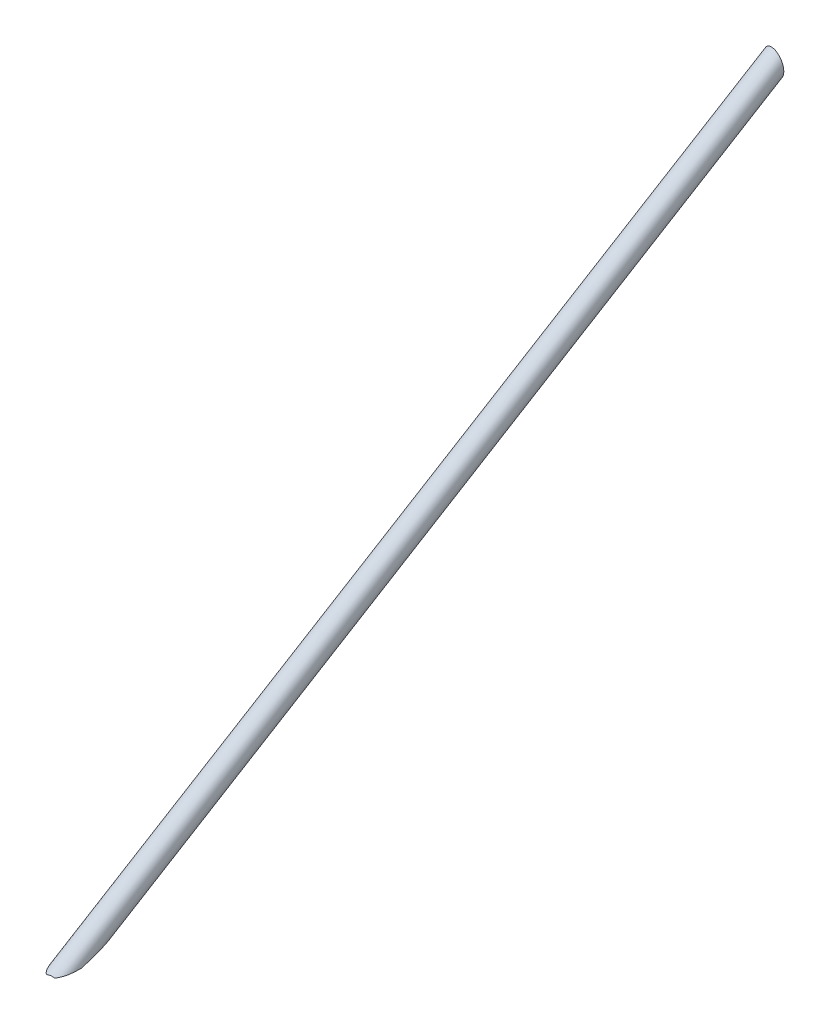
ISO-10303-21;
HEADER;
FILE_DESCRIPTION(('STEP AP214'),'2;1');
FILE_NAME('part.step','',(''),(''),'','','');
FILE_SCHEMA(('AUTOMOTIVE_DESIGN { 1 0 10303 214 1 1 1 1 }'));
ENDSEC;
DATA;
#1=APPLICATION_CONTEXT('core data for automotive mechanical design processes');
#2=APPLICATION_PROTOCOL_DEFINITION('international standard','automotive_design',2000,#1);
#3=PRODUCT_CONTEXT('',#1,'mechanical');
#4=PRODUCT('Part','Part','',(#3));
#5=PRODUCT_RELATED_PRODUCT_CATEGORY('part','',(#4));
#6=PRODUCT_DEFINITION_FORMATION('','',#4);
#7=PRODUCT_DEFINITION_CONTEXT('part definition',#1,'design');
#8=PRODUCT_DEFINITION('design','',#6,#7);
#9=PRODUCT_DEFINITION_SHAPE('','',#8);
#10=(LENGTH_UNIT() NAMED_UNIT(*) SI_UNIT(.MILLI.,.METRE.));
#11=(NAMED_UNIT(*) PLANE_ANGLE_UNIT() SI_UNIT($,.RADIAN.));
#12=(NAMED_UNIT(*) SI_UNIT($,.STERADIAN.) SOLID_ANGLE_UNIT());
#13=UNCERTAINTY_MEASURE_WITH_UNIT(LENGTH_MEASURE(1.E-05),#10,'distance_accuracy_value','');
#14=(GEOMETRIC_REPRESENTATION_CONTEXT(3) GLOBAL_UNCERTAINTY_ASSIGNED_CONTEXT((#13)) GLOBAL_UNIT_ASSIGNED_CONTEXT((#10,
#11,#12)) REPRESENTATION_CONTEXT('',''));
#15=CARTESIAN_POINT('',(0.,0.,0.));
#16=DIRECTION('',(0.,0.,1.));
#17=DIRECTION('',(1.,0.,0.));
#18=AXIS2_PLACEMENT_3D('',#15,#16,#17);
#19=CARTESIAN_POINT('',(150.,500.,-1140.));
#20=DIRECTION('',(0.0991899501072693,-0.396759800429077,0.912547540986877));
#21=DIRECTION('',(0.,-0.917070056253235,-0.39872611141445));
#22=AXIS2_PLACEMENT_3D('',#19,#20,#21);
#23=CYLINDRICAL_SURFACE('',#22,9.49999999999999);
#24=CARTESIAN_POINT('',(215.,239.999999999999,-541.999999999997));
#25=DIRECTION('',(1.,0.,0.));
#26=DIRECTION('',(0.,-0.39872611141445,0.917070056253235));
#27=AXIS2_PLACEMENT_3D('',#24,#25,#26);
#28=ELLIPSE('',#27,95.7758320245769,9.49999999999999);
#29=CARTESIAN_POINT('',(215.,201.032135562642,-460.));
#30=VERTEX_POINT('',#29);
#31=CARTESIAN_POINT('',(215.,210.,-491.99411301346));
#32=VERTEX_POINT('',#31);
#33=EDGE_CURVE('E119',#30,#32,#28,.T.);
#34=ORIENTED_EDGE('',*,*,#33,.F.);
#35=CARTESIAN_POINT('',(223.913043478261,204.347826086957,-460.));
#36=DIRECTION('',(0.,0.,1.));
#37=DIRECTION('',(0.242535625036333,-0.970142500145332,0.));
#38=AXIS2_PLACEMENT_3D('',#35,#36,#37);
#39=ELLIPSE('',#38,10.4104165244105,9.49999999999999);
#40=CARTESIAN_POINT('',(215.,208.496122260805,-460.));
#41=VERTEX_POINT('',#40);
#42=EDGE_CURVE('E118',#41,#30,#39,.T.);
#43=ORIENTED_EDGE('',*,*,#42,.F.);
#44=CARTESIAN_POINT('',(215.,210.,-462.123534045363));
#45=VERTEX_POINT('',#44);
#46=EDGE_CURVE('E111',#45,#41,#28,.T.);
#47=ORIENTED_EDGE('',*,*,#46,.F.);
#48=CARTESIAN_POINT('',(222.5,210.,-473.));
#49=DIRECTION('',(0.,-1.,0.));
#50=DIRECTION('',(0.108059180768419,0.,0.994144463069457));
#51=AXIS2_PLACEMENT_3D('',#48,#49,#50);
#52=ELLIPSE('',#51,23.9439580061442,9.49999999999999);
#53=CARTESIAN_POINT('',(222.198724332156,210.,-449.944988564055));
#54=VERTEX_POINT('',#53);
#55=EDGE_CURVE('E102',#54,#45,#52,.T.);
#56=ORIENTED_EDGE('',*,*,#55,.F.);
#57=CARTESIAN_POINT('',(225.,200.,-450.));
#58=DIRECTION('',(0.151358668812017,0.0369657748955679,0.987787469480062));
#59=DIRECTION('',(-0.0862856240757923,-0.994991904096065,0.0504569307542324));
#60=AXIS2_PLACEMENT_3D('',#57,#58,#59);
#61=ELLIPSE('',#60,10.5350735975657,9.49999999999999);
#62=CARTESIAN_POINT('',(228.03179893834,210.,-450.838790555629));
#63=VERTEX_POINT('',#62);
#64=EDGE_CURVE('E141',#63,#54,#61,.T.);
#65=ORIENTED_EDGE('',*,*,#64,.F.);
#66=CARTESIAN_POINT('',(232.244654819335,210.,-470.016908058468));
#67=VERTEX_POINT('',#66);
#68=EDGE_CURVE('E82',#67,#63,#52,.T.);
#69=ORIENTED_EDGE('',*,*,#68,.F.);
#70=CARTESIAN_POINT('',(225.,200.,-449.999999999999));
#71=DIRECTION('',(0.526368183981438,-0.821349611595142,-0.219821178289519));
#72=DIRECTION('',(0.00585697944915487,-0.255026319830916,0.966916372798202));
#73=AXIS2_PLACEMENT_3D('',#70,#71,#72);
#74=ELLIPSE('',#73,53.5236397538821,9.49999999999999);
#75=CARTESIAN_POINT('',(221.079548000573,210.,-496.752080009965));
#76=VERTEX_POINT('',#75);
#77=EDGE_CURVE('E129',#76,#67,#74,.T.);
#78=ORIENTED_EDGE('',*,*,#77,.F.);
#79=CARTESIAN_POINT('',(222.5,210.,-473.));
#80=DIRECTION('',(0.,-1.,0.));
#81=DIRECTION('',(0.108059180768419,0.,0.994144463069457));
#82=AXIS2_PLACEMENT_3D('',#79,#80,#81);
#83=ELLIPSE('',#82,23.9439580061442,9.49999999999999);
#84=EDGE_CURVE('E122',#32,#76,#83,.T.);
#85=ORIENTED_EDGE('',*,*,#84,.F.);
#86=EDGE_LOOP('',(#34,#43,#47,#56,#65,#69,#78,#85));
#87=FACE_BOUND('',#86,.T.);
#88=CARTESIAN_POINT('',(150.,500.,-1140.));
#89=DIRECTION('',(0.136924020573454,0.0230393226257371,-0.990313587810925));
#90=DIRECTION('',(0.508281006832032,-0.859722512143854,0.0502754433782237));
#91=AXIS2_PLACEMENT_3D('',#88,#89,#90);
#92=ELLIPSE('',#91,10.5641498478138,9.49999999999999);
#93=CARTESIAN_POINT('',(155.369556720971,490.917762554174,-1139.46888268249));
#94=VERTEX_POINT('',#93);
#95=EDGE_CURVE('E11',#94,#94,#92,.T.);
#96=ORIENTED_EDGE('',*,*,#95,.F.);
#97=EDGE_LOOP('',(#96));
#98=FACE_BOUND('',#97,.T.);
#99=ADVANCED_FACE('F39',(#87,#98),#23,.T.);
#100=CARTESIAN_POINT('',(150.,500.,-1140.));
#101=DIRECTION('',(0.0991899501072693,-0.396759800429077,0.912547540986877));
#102=DIRECTION('',(0.,-0.917070056253235,-0.39872611141445));
#103=AXIS2_PLACEMENT_3D('',#100,#101,#102);
#104=CYLINDRICAL_SURFACE('',#103,7.90000000000002);
#105=CARTESIAN_POINT('',(215.,239.999999999999,-541.999999999997));
#106=DIRECTION('',(1.,0.,0.));
#107=DIRECTION('',(0.,-0.39872611141445,0.917070056253235));
#108=AXIS2_PLACEMENT_3D('',#105,#106,#107);
#109=ELLIPSE('',#108,79.6451655783327,7.90000000000002);
#110=CARTESIAN_POINT('',(215.,210.,-469.53470066269));
#111=VERTEX_POINT('',#110);
#112=CARTESIAN_POINT('',(215.,210.,-484.582946396133));
#113=VERTEX_POINT('',#112);
#114=EDGE_CURVE('E113',#111,#113,#109,.T.);
#115=ORIENTED_EDGE('',*,*,#114,.T.);
#116=CARTESIAN_POINT('',(222.5,210.,-473.));
#117=DIRECTION('',(0.,-1.,0.));
#118=DIRECTION('',(0.108059180768419,0.,0.994144463069457));
#119=AXIS2_PLACEMENT_3D('',#116,#117,#118);
#120=ELLIPSE('',#119,19.9112913945832,7.90000000000002);
#121=CARTESIAN_POINT('',(221.009004228266,210.,-492.797123160762));
#122=VERTEX_POINT('',#121);
#123=EDGE_CURVE('E58',#113,#122,#120,.T.);
#124=ORIENTED_EDGE('',*,*,#123,.T.);
#125=CARTESIAN_POINT('',(220.771578028085,209.66883444326,-492.051418421793));
#126=CARTESIAN_POINT('',(220.80291647713,209.713571123085,-492.154311779107));
#127=CARTESIAN_POINT('',(220.834722799832,209.758566227835,-492.25694951712));
#128=CARTESIAN_POINT('',(220.899342624229,209.849105805966,-492.461665983789));
#129=CARTESIAN_POINT('',(220.932156140443,209.894650287261,-492.56374470436));
#130=CARTESIAN_POINT('',(221.032230516905,210.032174776604,-492.869104140973));
#131=CARTESIAN_POINT('',(221.101112566758,210.125027730757,-493.071466401526));
#132=CARTESIAN_POINT('',(221.244254551172,210.313809732742,-493.474104209087));
#133=CARTESIAN_POINT('',(221.31853800325,210.409751076582,-493.674365677505));
#134=CARTESIAN_POINT('',(221.473150962767,210.604683171648,-494.07098119205));
#135=CARTESIAN_POINT('',(221.553478928598,210.703673141566,-494.267336218441));
#136=CARTESIAN_POINT('',(221.722460707669,210.906402538565,-494.657204960414));
#137=CARTESIAN_POINT('',(221.811198341639,211.010182992836,-494.850661501381));
#138=CARTESIAN_POINT('',(221.998084291993,211.222125608651,-495.230439529145));
#139=CARTESIAN_POINT('',(222.096229196485,211.33028617343,-495.416763568754));
#140=CARTESIAN_POINT('',(222.304172722627,211.551430654638,-495.778310860886));
#141=CARTESIAN_POINT('',(222.413904125539,211.664384697849,-495.953589641158));
#142=CARTESIAN_POINT('',(222.590516801185,211.83858717683,-496.204446716078));
#143=CARTESIAN_POINT('',(222.651326891215,211.89739183668,-496.285983871526));
#144=CARTESIAN_POINT('',(222.777692617761,212.016777955497,-496.443889924641));
#145=CARTESIAN_POINT('',(222.843246354313,212.077358697373,-496.520260868066));
#146=CARTESIAN_POINT('',(222.995381004473,212.214340544152,-496.682733124522));
#147=CARTESIAN_POINT('',(223.08336826872,212.291226098837,-496.767139793351));
#148=CARTESIAN_POINT('',(223.269445779155,212.447802223946,-496.921098444059));
#149=CARTESIAN_POINT('',(223.367521969717,212.527488792791,-496.990670688262));
#150=CARTESIAN_POINT('',(223.54673442814,212.66667877563,-497.091709517848));
#151=CARTESIAN_POINT('',(223.625200326987,212.725762499952,-497.128393739845));
#152=CARTESIAN_POINT('',(223.787845318843,212.843742768069,-497.186218486637));
#153=CARTESIAN_POINT('',(223.872014502496,212.902639459386,-497.207385252749));
#154=CARTESIAN_POINT('',(224.0309371475,213.009252635452,-497.228740487638));
#155=CARTESIAN_POINT('',(224.105101040888,213.057275608855,-497.231695024249));
#156=CARTESIAN_POINT('',(224.254418456048,213.150283111301,-497.222737859764));
#157=CARTESIAN_POINT('',(224.329571335061,213.19526950759,-497.210835383932));
#158=CARTESIAN_POINT('',(224.478503824213,213.280805674852,-497.172604015924));
#159=CARTESIAN_POINT('',(224.55228548304,213.321362595794,-497.146298797882));
#160=CARTESIAN_POINT('',(224.696829759017,213.397459013315,-497.081154231899));
#161=CARTESIAN_POINT('',(224.767589133081,213.432993210149,-497.042301784568));
#162=CARTESIAN_POINT('',(224.93938916997,213.515489218902,-496.932638171133));
#163=CARTESIAN_POINT('',(225.037908242893,213.559297734816,-496.855556067912));
#164=CARTESIAN_POINT('',(225.225413313446,213.637142727886,-496.686358734074));
#165=CARTESIAN_POINT('',(225.3143706472,213.671150309775,-496.594200282304));
#166=CARTESIAN_POINT('',(225.479623225199,213.729858365264,-496.404797779882));
#167=CARTESIAN_POINT('',(225.556321229115,213.754927134376,-496.308009958452));
#168=CARTESIAN_POINT('',(225.703167987844,213.799399389097,-496.108293964282));
#169=CARTESIAN_POINT('',(225.773310176605,213.81879723543,-496.005359801134));
#170=CARTESIAN_POINT('',(225.908186166022,213.853060100567,-495.794977080874));
#171=CARTESIAN_POINT('',(225.972906765066,213.867914275872,-495.687518410009));
#172=CARTESIAN_POINT('',(226.09759291798,213.893866015656,-495.469533031301));
#173=CARTESIAN_POINT('',(226.157560625375,213.904965289012,-495.359007743939));
#174=CARTESIAN_POINT('',(226.316078777259,213.931094768798,-495.053593229079));
#175=CARTESIAN_POINT('',(226.410618888961,213.943024955702,-494.856361843023));
#176=CARTESIAN_POINT('',(226.590411822836,213.959962841337,-494.457376195615));
#177=CARTESIAN_POINT('',(226.675658846492,213.964966240548,-494.255619204052));
#178=CARTESIAN_POINT('',(226.838821837765,213.969572930706,-493.848657404483));
#179=CARTESIAN_POINT('',(226.916722770744,213.969165379144,-493.64344649702));
#180=CARTESIAN_POINT('',(227.066341799505,213.963999826986,-493.230832093996));
#181=CARTESIAN_POINT('',(227.138059157637,213.95924130814,-493.023428340149));
#182=CARTESIAN_POINT('',(227.276676457621,213.946109212068,-492.60583067729));
#183=CARTESIAN_POINT('',(227.343546679655,213.937715227571,-492.395627608228));
#184=CARTESIAN_POINT('',(227.472775794478,213.917894351588,-491.9739779196));
#185=CARTESIAN_POINT('',(227.535134460117,213.906467307525,-491.762531237998));
#186=CARTESIAN_POINT('',(227.65583638974,213.881048638421,-491.338984114561));
#187=CARTESIAN_POINT('',(227.714185323139,213.867060741275,-491.126885058046));
#188=CARTESIAN_POINT('',(227.82741940005,213.836857136113,-490.701934434441));
#189=CARTESIAN_POINT('',(227.882304647448,213.82064149496,-490.489082890122));
#190=CARTESIAN_POINT('',(228.062913288025,213.762473762526,-489.767473893792));
#191=CARTESIAN_POINT('',(228.181440794922,213.715987715737,-489.257272406901));
#192=CARTESIAN_POINT('',(228.404678457246,213.61477937088,-488.2346412467));
#193=CARTESIAN_POINT('',(228.509386249476,213.560055667574,-487.722211207738));
#194=CARTESIAN_POINT('',(228.707358913301,213.444150278379,-486.695591577811));
#195=CARTESIAN_POINT('',(228.800617470832,213.382965063361,-486.181401175263));
#196=CARTESIAN_POINT('',(228.977259944239,213.255476053094,-485.151956540281));
#197=CARTESIAN_POINT('',(229.06064353008,213.18917208689,-484.636702272876));
#198=CARTESIAN_POINT('',(229.218913128884,213.052246782952,-483.60391485624));
#199=CARTESIAN_POINT('',(229.293773804571,212.981613485496,-483.086379430991));
#200=CARTESIAN_POINT('',(229.435548601145,212.83701124627,-482.050684225143));
#201=CARTESIAN_POINT('',(229.502462609286,212.763042257195,-481.532524435791));
#202=CARTESIAN_POINT('',(229.628902839639,212.612478368793,-480.495882770478));
#203=CARTESIAN_POINT('',(229.688431725634,212.535884429072,-479.977401078841));
#204=CARTESIAN_POINT('',(229.800518252919,212.380648736534,-478.939985624279));
#205=CARTESIAN_POINT('',(229.853075797752,212.302006955403,-478.4210518552));
#206=CARTESIAN_POINT('',(229.951318049492,212.14343773545,-477.384055239305));
#207=CARTESIAN_POINT('',(229.997019417803,212.063513953544,-476.865993408848));
#208=CARTESIAN_POINT('',(230.081769009671,211.902744741185,-475.829475107859));
#209=CARTESIAN_POINT('',(230.1208173095,211.821899321308,-475.311018641921));
#210=CARTESIAN_POINT('',(230.192178097659,211.659838427664,-474.273576413641));
#211=CARTESIAN_POINT('',(230.224489029559,211.578622872809,-473.754590556765));
#212=CARTESIAN_POINT('',(230.282097087276,211.41646106956,-472.716189296133));
#213=CARTESIAN_POINT('',(230.307394258377,211.335514819431,-472.196773895172));
#214=CARTESIAN_POINT('',(230.35045197778,211.174764211604,-471.158574554498));
#215=CARTESIAN_POINT('',(230.368228305901,211.094957805952,-470.639791592829));
#216=CARTESIAN_POINT('',(230.395577713167,210.9371377331,-469.601738623651));
#217=CARTESIAN_POINT('',(230.405150920069,210.859124037997,-469.082468623855));
#218=CARTESIAN_POINT('',(230.4149804183,210.705915818009,-468.043569013116));
#219=CARTESIAN_POINT('',(230.415239362185,210.630720496588,-467.523939546701));
#220=CARTESIAN_POINT('',(230.404826458763,210.484386549812,-466.48423323306));
#221=CARTESIAN_POINT('',(230.394155489487,210.41324759908,-465.964156425123));
#222=CARTESIAN_POINT('',(230.36923169793,210.315156992606,-465.216950583135));
#223=CARTESIAN_POINT('',(230.360388450339,210.285901219002,-464.989939686701));
#224=CARTESIAN_POINT('',(230.339876505582,210.228642590943,-464.535886137925));
#225=CARTESIAN_POINT('',(230.328207791552,210.200639743968,-464.3088434854));
#226=CARTESIAN_POINT('',(230.288502317864,210.118763358602,-463.627598393631));
#227=CARTESIAN_POINT('',(230.255769797693,210.067037410936,-463.173395055812));
#228=CARTESIAN_POINT('',(230.174499412864,209.971086468105,-462.265671125238));
#229=CARTESIAN_POINT('',(230.125966449869,209.926859153153,-461.812150364509));
#230=CARTESIAN_POINT('',(230.037637671105,209.86782345681,-461.13330609401));
#231=CARTESIAN_POINT('',(230.005610571897,209.849363944474,-460.9072870786));
#232=CARTESIAN_POINT('',(229.935545501239,209.815206337551,-460.455979493686));
#233=CARTESIAN_POINT('',(229.897507893793,209.799508075858,-460.230690880791));
#234=CARTESIAN_POINT('',(229.802284530904,209.767068562375,-459.715279567308));
#235=CARTESIAN_POINT('',(229.742754481083,209.75137100709,-459.425514567859));
#236=CARTESIAN_POINT('',(229.609441241346,209.725940069321,-458.848915255037));
#237=CARTESIAN_POINT('',(229.535655981363,209.716207553907,-458.562081373682));
#238=CARTESIAN_POINT('',(229.370788433414,209.703409434439,-457.993732081665));
#239=CARTESIAN_POINT('',(229.27973598259,209.700332441994,-457.712208404406));
#240=CARTESIAN_POINT('',(229.076552877348,209.701206238361,-457.156866141107));
#241=CARTESIAN_POINT('',(228.964432834292,209.705153497627,-456.883043755546));
#242=CARTESIAN_POINT('',(228.754508336915,209.717425139408,-456.431591210026));
#243=CARTESIAN_POINT('',(228.663323040321,209.723978640031,-456.250835209912));
#244=CARTESIAN_POINT('',(228.468147987702,209.739772737284,-455.896520834094));
#245=CARTESIAN_POINT('',(228.364162679464,209.749012402029,-455.722959986064));
#246=CARTESIAN_POINT('',(228.142696354685,209.769396764415,-455.385060385996));
#247=CARTESIAN_POINT('',(228.025232503759,209.780539047615,-455.220710292257));
#248=CARTESIAN_POINT('',(227.776390882697,209.803573231647,-454.902924345559));
#249=CARTESIAN_POINT('',(227.645013455997,209.815465113972,-454.749488223359));
#250=CARTESIAN_POINT('',(227.367534739251,209.838567913528,-454.454103201377));
#251=CARTESIAN_POINT('',(227.221322402679,209.849772506749,-454.31225786231));
#252=CARTESIAN_POINT('',(226.916075748337,209.869571931181,-454.042883621582));
#253=CARTESIAN_POINT('',(226.757041038924,209.878166682639,-453.915355157495));
#254=CARTESIAN_POINT('',(226.427599214868,209.890841265493,-453.675404456448));
#255=CARTESIAN_POINT('',(226.257183042713,209.894917454454,-453.562994470607));
#256=CARTESIAN_POINT('',(225.907045030383,209.89671869402,-453.353713478976));
#257=CARTESIAN_POINT('',(225.727323492714,209.894443950959,-453.256841968467));
#258=CARTESIAN_POINT('',(225.379493720697,209.882592407971,-453.087611547812));
#259=CARTESIAN_POINT('',(225.212082114252,209.873787595846,-453.013758075551));
#260=CARTESIAN_POINT('',(224.873009025791,209.848832816534,-452.878078421849));
#261=CARTESIAN_POINT('',(224.701347927603,209.832683510453,-452.8162511586));
#262=CARTESIAN_POINT('',(224.355232998345,209.792291399858,-452.704144399615));
#263=CARTESIAN_POINT('',(224.180779071916,209.768048318421,-452.653865299092));
#264=CARTESIAN_POINT('',(223.830460974399,209.710917737331,-452.564328719331));
#265=CARTESIAN_POINT('',(223.654596710072,209.678029661502,-452.525071975077));
#266=CARTESIAN_POINT('',(223.289959297011,209.600516289137,-452.454584300675));
#267=CARTESIAN_POINT('',(223.101177270771,209.555211462138,-452.424144444103));
#268=CARTESIAN_POINT('',(222.724967692863,209.453975570792,-452.374741847501));
#269=CARTESIAN_POINT('',(222.53754018815,209.398044139892,-452.355779503468));
#270=CARTESIAN_POINT('',(222.165369925323,209.275484117344,-452.328794618528));
#271=CARTESIAN_POINT('',(221.980627782425,209.208853115272,-452.320774546595));
#272=CARTESIAN_POINT('',(221.615143584394,209.065017342947,-452.315230719835));
#273=CARTESIAN_POINT('',(221.434401680741,208.987812173067,-452.317707361813));
#274=CARTESIAN_POINT('',(221.066716198813,208.817832330635,-452.333277781566));
#275=CARTESIAN_POINT('',(220.880114435694,208.724377979722,-452.347039939588));
#276=CARTESIAN_POINT('',(220.514117987717,208.526317281028,-452.38571188335));
#277=CARTESIAN_POINT('',(220.33472362066,208.421710442234,-452.410622160065));
#278=CARTESIAN_POINT('',(219.984351042359,208.202021926947,-452.471388175885));
#279=CARTESIAN_POINT('',(219.813374466549,208.086938227256,-452.507246032249));
#280=CARTESIAN_POINT('',(219.481024196442,207.8471951785,-452.589812112789));
#281=CARTESIAN_POINT('',(219.319650498026,207.722535833544,-452.636520332311));
#282=CARTESIAN_POINT('',(219.005002283481,207.462598194951,-452.741664093113));
#283=CARTESIAN_POINT('',(218.851903637025,207.327179454611,-452.800279125653));
#284=CARTESIAN_POINT('',(218.557716224911,207.048891213933,-452.928885698066));
#285=CARTESIAN_POINT('',(218.416627707278,206.906021559824,-452.998877472796));
#286=CARTESIAN_POINT('',(218.14733230112,206.614390538411,-453.150506523079));
#287=CARTESIAN_POINT('',(218.019127163532,206.465628374097,-453.232145377908));
#288=CARTESIAN_POINT('',(217.776375474417,206.164074293372,-453.407419556796));
#289=CARTESIAN_POINT('',(217.66182856732,206.011282481992,-453.501054568423));
#290=CARTESIAN_POINT('',(217.449156905173,205.706919527224,-453.698720184977));
#291=CARTESIAN_POINT('',(217.350746252304,205.55538645482,-453.802501496693));
#292=CARTESIAN_POINT('',(217.167949989641,205.252785850969,-454.022390518868));
#293=CARTESIAN_POINT('',(217.083564231738,205.101718314623,-454.138498099136));
#294=CARTESIAN_POINT('',(216.929004883608,204.802761139226,-454.383221985518));
#295=CARTESIAN_POINT('',(216.858816373195,204.654868311507,-454.511824947272));
#296=CARTESIAN_POINT('',(216.73233405958,204.364842702207,-454.781732596357));
#297=CARTESIAN_POINT('',(216.676038867604,204.222709346098,-454.923036012224));
#298=CARTESIAN_POINT('',(216.580539199739,203.957504214198,-455.206799655431));
#299=CARTESIAN_POINT('',(216.54035750892,203.833805784496,-455.348346513611));
#300=CARTESIAN_POINT('',(216.470554038966,203.595695952486,-455.641479006224));
#301=CARTESIAN_POINT('',(216.440931201963,203.481283620712,-455.79306363319));
#302=CARTESIAN_POINT('',(216.391196757865,203.263440717543,-456.105299760882));
#303=CARTESIAN_POINT('',(216.371081162715,203.160005555639,-456.265947428175));
#304=CARTESIAN_POINT('',(216.339079822453,202.965176022482,-456.595162767568));
#305=CARTESIAN_POINT('',(216.327195061331,202.873783091927,-456.76373138404));
#306=CARTESIAN_POINT('',(216.308491454118,202.685348878137,-457.144198442652));
#307=CARTESIAN_POINT('',(216.303300437674,202.591282462886,-457.357651261834));
#308=CARTESIAN_POINT('',(216.300680717254,202.421444928126,-457.791737290503));
#309=CARTESIAN_POINT('',(216.303254169816,202.345678897758,-458.012372478016));
#310=CARTESIAN_POINT('',(216.314101250403,202.211129761292,-458.459029163546));
#311=CARTESIAN_POINT('',(216.322385926735,202.152379886162,-458.685060280346));
#312=CARTESIAN_POINT('',(216.342996864096,202.05033614882,-459.140329177109));
#313=CARTESIAN_POINT('',(216.355322931926,202.007041547975,-459.369566803284));
#314=CARTESIAN_POINT('',(216.385472674838,201.926760617056,-459.875612421763));
#315=CARTESIAN_POINT('',(216.403901735689,201.892724107674,-460.152845934142));
#316=CARTESIAN_POINT('',(216.44324949153,201.840954907461,-460.708705097589));
#317=CARTESIAN_POINT('',(216.464169298459,201.823229529432,-460.987331316823));
#318=CARTESIAN_POINT('',(216.507572544399,201.801340291295,-461.545439393919));
#319=CARTESIAN_POINT('',(216.530058615927,201.797199854724,-461.824921898845));
#320=CARTESIAN_POINT('',(216.575960683015,201.800246505501,-462.383680280414));
#321=CARTESIAN_POINT('',(216.599376549223,201.807432022515,-462.66295618033));
#322=CARTESIAN_POINT('',(216.64699975641,201.831363972159,-463.223555367923));
#323=CARTESIAN_POINT('',(216.671212333241,201.848196107509,-463.50487438585));
#324=CARTESIAN_POINT('',(216.720020542972,201.889939537336,-464.06687289646));
#325=CARTESIAN_POINT('',(216.744616185811,201.914851041742,-464.347552372335));
#326=CARTESIAN_POINT('',(216.794057168176,201.971478008394,-464.907859285166));
#327=CARTESIAN_POINT('',(216.818902181798,202.003185473907,-465.187487568901));
#328=CARTESIAN_POINT('',(216.868830374742,202.072434219048,-465.745984101465));
#329=CARTESIAN_POINT('',(216.893913547852,202.109975346944,-466.024852369871));
#330=CARTESIAN_POINT('',(216.969796280478,202.230552844928,-466.863431258624));
#331=CARTESIAN_POINT('',(217.020955304434,202.321211183592,-467.422016411698));
#332=CARTESIAN_POINT('',(217.124488386327,202.517955243519,-468.536374564002));
#333=CARTESIAN_POINT('',(217.176862613442,202.624043123833,-469.092147158389));
#334=CARTESIAN_POINT('',(217.283271408019,202.848517677369,-470.20130634838));
#335=CARTESIAN_POINT('',(217.337306749538,202.966910147472,-470.754691690279));
#336=CARTESIAN_POINT('',(217.447485347683,203.213749026848,-471.859007448829));
#337=CARTESIAN_POINT('',(217.503628657973,203.34219569216,-472.409937802583));
#338=CARTESIAN_POINT('',(217.618693691076,203.608030280928,-473.511208851689));
#339=CARTESIAN_POINT('',(217.677623661688,203.745445272219,-474.061542134146));
#340=CARTESIAN_POINT('',(217.798604630889,204.027769645572,-475.159942403014));
#341=CARTESIAN_POINT('',(217.860655666612,204.172679116805,-475.708009362375));
#342=CARTESIAN_POINT('',(217.988384837125,204.469189803232,-476.801679407144));
#343=CARTESIAN_POINT('',(218.054061591759,204.620788467783,-477.347283345724));
#344=CARTESIAN_POINT('',(218.189633292016,204.930236225359,-478.436186467177));
#345=CARTESIAN_POINT('',(218.259528212627,205.088085281319,-478.979485663696));
#346=CARTESIAN_POINT('',(218.40346799408,205.408184939546,-480.058406278697));
#347=CARTESIAN_POINT('',(218.477465979387,205.570377934196,-480.594051029333));
#348=CARTESIAN_POINT('',(218.630927656017,205.900502409488,-481.662791083546));
#349=CARTESIAN_POINT('',(218.710391393958,206.068433939068,-482.195886365336));
#350=CARTESIAN_POINT('',(218.875667395209,206.410174553387,-483.259529287978));
#351=CARTESIAN_POINT('',(218.96148305057,206.583986751228,-483.790075404126));
#352=CARTESIAN_POINT('',(219.140455833743,206.937614770835,-484.847911533641));
#353=CARTESIAN_POINT('',(219.233612789975,207.117430452232,-485.375201622798));
#354=CARTESIAN_POINT('',(219.42824042566,207.482835322714,-486.424103783805));
#355=CARTESIAN_POINT('',(219.529680683635,207.668401958773,-486.945729309582));
#356=CARTESIAN_POINT('',(219.742877125571,208.046552220372,-487.984292306992));
#357=CARTESIAN_POINT('',(219.854632819611,208.239135512401,-488.50122999999));
#358=CARTESIAN_POINT('',(220.090736560839,208.63216942745,-489.528767808713));
#359=CARTESIAN_POINT('',(220.215074445103,208.832613622138,-490.039372671217));
#360=CARTESIAN_POINT('',(220.413708610157,209.14041999956,-490.79914667594));
#361=CARTESIAN_POINT('',(220.481934303453,209.244202142292,-491.051359260253));
#362=CARTESIAN_POINT('',(220.62305804906,209.454432840372,-491.553350098293));
#363=CARTESIAN_POINT('',(220.695955834611,209.560881243274,-491.803128490068));
#364=CARTESIAN_POINT('',(220.771578028085,209.66883444326,-492.051418421793));
#365=B_SPLINE_CURVE_WITH_KNOTS('',3,(#125,#126,#127,#128,#129,#130,#131,#132,#133,#134,#135,
#136,#137,#138,#139,#140,#141,#142,#143,#144,#145,#146,#147,#148,#149,#150,#151,#152,#153,#154,
#155,#156,#157,#158,#159,#160,#161,#162,#163,#164,#165,#166,#167,#168,#169,#170,#171,#172,#173,
#174,#175,#176,#177,#178,#179,#180,#181,#182,#183,#184,#185,#186,#187,#188,#189,#190,#191,#192,
#193,#194,#195,#196,#197,#198,#199,#200,#201,#202,#203,#204,#205,#206,#207,#208,#209,#210,#211,
#212,#213,#214,#215,#216,#217,#218,#219,#220,#221,#222,#223,#224,#225,#226,#227,#228,#229,#230,
#231,#232,#233,#234,#235,#236,#237,#238,#239,#240,#241,#242,#243,#244,#245,#246,#247,#248,#249,
#250,#251,#252,#253,#254,#255,#256,#257,#258,#259,#260,#261,#262,#263,#264,#265,#266,#267,#268,
#269,#270,#271,#272,#273,#274,#275,#276,#277,#278,#279,#280,#281,#282,#283,#284,#285,#286,#287,
#288,#289,#290,#291,#292,#293,#294,#295,#296,#297,#298,#299,#300,#301,#302,#303,#304,#305,#306,
#307,#308,#309,#310,#311,#312,#313,#314,#315,#316,#317,#318,#319,#320,#321,#322,#323,#324,#325,
#326,#327,#328,#329,#330,#331,#332,#333,#334,#335,#336,#337,#338,#339,#340,#341,#342,#343,#344,
#345,#346,#347,#348,#349,#350,#351,#352,#353,#354,#355,#356,#357,#358,#359,#360,#361,#362,#363,
#364),.UNSPECIFIED.,.T.,.F.,(4,2,2,2,2,2,2,2,2,2,2,2,2,2,2,2,2,2,2,2,2,2,2,2,2,2,2,2,2,2,2,2,2,
2,2,2,2,2,2,2,2,2,2,2,2,2,2,2,2,2,2,2,2,2,2,2,2,2,2,2,2,2,2,2,2,2,2,2,2,2,2,2,2,2,2,2,2,2,2,2,2,
2,2,2,2,2,2,2,2,2,2,2,2,2,2,2,2,2,2,2,2,2,2,2,2,2,2,2,2,2,2,2,2,2,2,2,2,2,2,4),(0.,
0.349474281032394,0.698953602606862,1.39805384148693,2.10040486029887,2.80257735309198,
3.51268393487458,4.22253393799908,4.92847115893507,5.28077164574474,5.63293179903554,
6.06458040995499,6.49563560110693,6.80918425412845,7.12220143923474,7.38620120360322,
7.65003712234222,7.91344066393412,8.17712009440432,8.57245917509176,8.96895214857383,
9.34641950995485,9.72426096524445,10.1029972301413,10.4815608975701,11.1381593892693,
11.7951652552421,12.4534878336961,13.1118888362589,13.7740345966831,14.4362136722131,
15.0974363539607,15.7586391943937,17.3358071547922,18.9132444652742,20.4915478356364,
22.0699039404054,23.6528360578401,25.2357906307193,26.8181725677088,28.400576396358,
29.9790702179093,31.5575459419446,33.13638591358,34.7152156913596,36.2907162269508,
37.8661922247882,39.4412195480723,41.0161203548259,41.7032796781233,42.3904431030867,
43.7651217511586,45.1393743477895,45.8263608262994,46.5133057158983,47.4016612203495,
48.2901458241992,49.1771089186557,50.0636264577709,50.6708365645567,51.2778362686374,
51.884071332437,52.4902914356892,53.1014413200088,53.7126098781853,54.3242707450332,
54.9359117399737,55.4848888263036,56.0338165069294,56.5827629706407,57.1317460299651,
57.7206446990038,58.3095636850108,58.8986155305688,59.4876896441474,60.1144089058968,
60.7411557717642,61.3680239271642,61.9948918137013,62.6320234778044,63.2691682963024,
63.9063995902454,64.5436142913247,65.1679080507236,65.7921952169312,66.415822858376,
67.0393881368124,67.6153073710691,68.1911688889943,68.7667886322973,69.3424771786428,
70.0413318457016,70.7403806335169,71.4407855331903,72.141156954895,72.980305261596,
73.8198296023462,74.6608007159917,75.5016552400489,76.3500985404461,77.1985638878985,
78.0460362834001,78.893486639828,80.5977691020522,82.302290273848,84.0076181435155,
85.7129894550807,87.4237698981429,89.1345707011784,90.8447247064623,92.5548685717475,
94.2484101590508,95.9419661927643,97.6364332361986,99.3308606883839,101.019323204045,
102.70770556886,104.394734911876,105.238092518585,106.081402015359),.UNSPECIFIED.);
#366=CARTESIAN_POINT('',(230.198379719978,210.,-462.537283209683));
#367=VERTEX_POINT('',#366);
#368=EDGE_CURVE('E132',#122,#367,#365,.T.);
#369=ORIENTED_EDGE('',*,*,#368,.T.);
#370=CARTESIAN_POINT('',(222.5,210.,-473.));
#371=DIRECTION('',(0.,-1.,0.));
#372=DIRECTION('',(0.108059180768419,0.,0.994144463069457));
#373=AXIS2_PLACEMENT_3D('',#370,#371,#372);
#374=ELLIPSE('',#373,19.9112913945832,7.90000000000002);
#375=EDGE_CURVE('E73',#367,#111,#374,.T.);
#376=ORIENTED_EDGE('',*,*,#375,.T.);
#377=EDGE_LOOP('',(#115,#124,#369,#376));
#378=FACE_BOUND('',#377,.T.);
#379=CARTESIAN_POINT('',(150.,500.,-1140.));
#380=DIRECTION('',(0.136924020573454,0.0230393226257371,-0.990313587810925));
#381=DIRECTION('',(0.508281006832032,-0.859722512143854,0.0502754433782237));
#382=AXIS2_PLACEMENT_3D('',#379,#380,#381);
#383=ELLIPSE('',#382,8.78492461028727,7.90000000000002);
#384=CARTESIAN_POINT('',(154.46521032586,492.44740254505,-1139.55833402017));
#385=VERTEX_POINT('',#384);
#386=EDGE_CURVE('E43',#385,#385,#383,.T.);
#387=ORIENTED_EDGE('',*,*,#386,.T.);
#388=EDGE_LOOP('',(#387));
#389=FACE_BOUND('',#388,.T.);
#390=ADVANCED_FACE('F147',(#378,#389),#104,.F.);
#391=CARTESIAN_POINT('',(325.000000000001,320.,-1580.));
#392=DIRECTION('',(-0.0876619818920292,-0.105194378270435,0.99058039537993));
#393=DIRECTION('',(0.,-0.994408591727349,-0.105600912395825));
#394=AXIS2_PLACEMENT_3D('',#391,#392,#393);
#395=CYLINDRICAL_SURFACE('',#394,9.49999999999999);
#396=ORIENTED_EDGE('',*,*,#368,.F.);
#397=CARTESIAN_POINT('',(233.333333333334,210.,-544.166666666668));
#398=DIRECTION('',(0.,-1.,0.));
#399=DIRECTION('',(-0.0881510722971012,0.,0.996107116957243));
#400=AXIS2_PLACEMENT_3D('',#397,#398,#399);
#401=ELLIPSE('',#400,90.3090084869104,9.49999999999999);
#402=EDGE_CURVE('E130',#122,#76,#401,.T.);
#403=ORIENTED_EDGE('',*,*,#402,.T.);
#404=ORIENTED_EDGE('',*,*,#77,.T.);
#405=EDGE_CURVE('E126',#67,#367,#401,.T.);
#406=ORIENTED_EDGE('',*,*,#405,.T.);
#407=EDGE_LOOP('',(#396,#403,#404,#406));
#408=FACE_BOUND('',#407,.T.);
#409=ADVANCED_FACE('F150',(#408),#395,.F.);
#410=CARTESIAN_POINT('',(225.,190.,-460.));
#411=DIRECTION('',(0.,0.,1.));
#412=DIRECTION('',(1.,0.,0.));
#413=AXIS2_PLACEMENT_3D('',#410,#411,#412);
#414=PLANE('',#413);
#415=ORIENTED_EDGE('',*,*,#42,.T.);
#416=DIRECTION('',(0.,1.,0.));
#417=VECTOR('',#416,1.);
#418=CARTESIAN_POINT('',(215.,190.,-460.));
#419=LINE('',#418,#417);
#420=EDGE_CURVE('E175',#30,#41,#419,.T.);
#421=ORIENTED_EDGE('',*,*,#420,.T.);
#422=EDGE_LOOP('',(#415,#421));
#423=FACE_BOUND('',#422,.T.);
#424=ADVANCED_FACE('F155',(#423),#414,.T.);
#425=CARTESIAN_POINT('',(225.,200.,-450.000000000001));
#426=DIRECTION('',(-0.173785333909048,-0.463427557090794,-0.868926669545238));
#427=DIRECTION('',(0.,0.882352941176471,-0.470588235294118));
#428=AXIS2_PLACEMENT_3D('',#425,#426,#427);
#429=CYLINDRICAL_SURFACE('',#428,9.49999999999999);
#430=ORIENTED_EDGE('',*,*,#64,.T.);
#431=CARTESIAN_POINT('',(228.75,210.,-431.250000000001));
#432=DIRECTION('',(0.,-1.,0.));
#433=DIRECTION('',(-0.196116135138185,0.,-0.98058067569092));
#434=AXIS2_PLACEMENT_3D('',#431,#432,#433);
#435=ELLIPSE('',#434,20.4994283456881,9.49999999999999);
#436=EDGE_CURVE('E99',#54,#63,#435,.T.);
#437=ORIENTED_EDGE('',*,*,#436,.T.);
#438=EDGE_LOOP('',(#430,#437));
#439=FACE_BOUND('',#438,.T.);
#440=ADVANCED_FACE('F156',(#439),#429,.F.);
#441=CARTESIAN_POINT('',(225.,210.,-460.));
#442=DIRECTION('',(0.,-1.,0.));
#443=DIRECTION('',(0.,0.,-1.));
#444=AXIS2_PLACEMENT_3D('',#441,#442,#443);
#445=PLANE('',#444);
#446=ORIENTED_EDGE('',*,*,#375,.F.);
#447=ORIENTED_EDGE('',*,*,#405,.F.);
#448=ORIENTED_EDGE('',*,*,#68,.T.);
#449=ORIENTED_EDGE('',*,*,#436,.F.);
#450=ORIENTED_EDGE('',*,*,#55,.T.);
#451=DIRECTION('',(0.,0.,-1.));
#452=VECTOR('',#451,1.);
#453=CARTESIAN_POINT('',(215.,210.,-200.));
#454=LINE('',#453,#452);
#455=EDGE_CURVE('E105',#45,#111,#454,.T.);
#456=ORIENTED_EDGE('',*,*,#455,.T.);
#457=EDGE_LOOP('',(#446,#447,#448,#449,#450,#456));
#458=FACE_BOUND('',#457,.T.);
#459=ADVANCED_FACE('F104',(#458),#445,.T.);
#460=CARTESIAN_POINT('',(215.,190.,-200.));
#461=DIRECTION('',(1.,0.,0.));
#462=DIRECTION('',(0.,0.,-1.));
#463=AXIS2_PLACEMENT_3D('',#460,#461,#462);
#464=PLANE('',#463);
#465=ORIENTED_EDGE('',*,*,#455,.F.);
#466=ORIENTED_EDGE('',*,*,#46,.T.);
#467=ORIENTED_EDGE('',*,*,#420,.F.);
#468=ORIENTED_EDGE('',*,*,#33,.T.);
#469=EDGE_CURVE('E49',#113,#32,#454,.T.);
#470=ORIENTED_EDGE('',*,*,#469,.F.);
#471=ORIENTED_EDGE('',*,*,#114,.F.);
#472=EDGE_LOOP('',(#465,#466,#467,#468,#470,#471));
#473=FACE_BOUND('',#472,.T.);
#474=ADVANCED_FACE('F110',(#473),#464,.T.);
#475=CARTESIAN_POINT('',(235.,210.,-200.));
#476=DIRECTION('',(0.,-1.,0.));
#477=DIRECTION('',(0.,0.,-1.));
#478=AXIS2_PLACEMENT_3D('',#475,#476,#477);
#479=PLANE('',#478);
#480=ORIENTED_EDGE('',*,*,#84,.T.);
#481=ORIENTED_EDGE('',*,*,#402,.F.);
#482=ORIENTED_EDGE('',*,*,#123,.F.);
#483=ORIENTED_EDGE('',*,*,#469,.T.);
#484=EDGE_LOOP('',(#480,#481,#482,#483));
#485=FACE_BOUND('',#484,.T.);
#486=ADVANCED_FACE('F134',(#485),#479,.T.);
#487=CARTESIAN_POINT('',(150.,500.,-1140.));
#488=DIRECTION('',(0.136924020573454,0.0230393226257371,-0.990313587810925));
#489=DIRECTION('',(-0.990576526863067,0.,-0.13696037539341));
#490=AXIS2_PLACEMENT_3D('',#487,#488,#489);
#491=PLANE('',#490);
#492=ORIENTED_EDGE('',*,*,#386,.F.);
#493=EDGE_LOOP('',(#492));
#494=FACE_BOUND('',#493,.T.);
#495=ORIENTED_EDGE('',*,*,#95,.T.);
#496=EDGE_LOOP('',(#495));
#497=FACE_BOUND('',#496,.T.);
#498=ADVANCED_FACE('F41',(#494,#497),#491,.T.);
#499=CLOSED_SHELL('',(#99,#390,#409,#424,#440,#459,#474,#486,#498));
#500=MANIFOLD_SOLID_BREP('B2',#499);
#501=ADVANCED_BREP_SHAPE_REPRESENTATION('',(#18,#500),#14);
#502=SHAPE_DEFINITION_REPRESENTATION(#9,#501);
ENDSEC;
END-ISO-10303-21;
